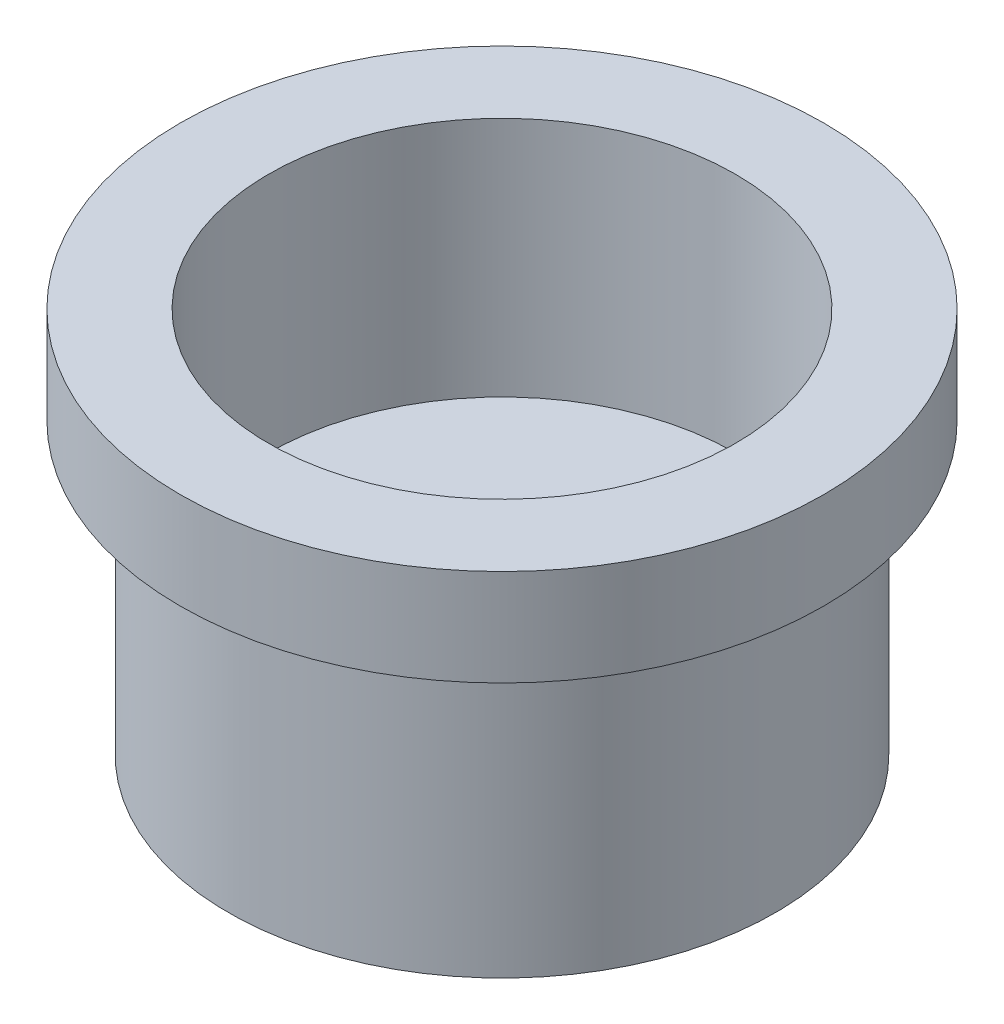
ISO-10303-21;
HEADER;
FILE_DESCRIPTION(('STEP AP214'),'2;1');
FILE_NAME('part.step','',(''),(''),'','','');
FILE_SCHEMA(('AUTOMOTIVE_DESIGN { 1 0 10303 214 1 1 1 1 }'));
ENDSEC;
DATA;
#1=APPLICATION_CONTEXT('core data for automotive mechanical design processes');
#2=APPLICATION_PROTOCOL_DEFINITION('international standard','automotive_design',2000,#1);
#3=PRODUCT_CONTEXT('',#1,'mechanical');
#4=PRODUCT('Part','Part','',(#3));
#5=PRODUCT_RELATED_PRODUCT_CATEGORY('part','',(#4));
#6=PRODUCT_DEFINITION_FORMATION('','',#4);
#7=PRODUCT_DEFINITION_CONTEXT('part definition',#1,'design');
#8=PRODUCT_DEFINITION('design','',#6,#7);
#9=PRODUCT_DEFINITION_SHAPE('','',#8);
#10=(LENGTH_UNIT() NAMED_UNIT(*) SI_UNIT(.MILLI.,.METRE.));
#11=(NAMED_UNIT(*) PLANE_ANGLE_UNIT() SI_UNIT($,.RADIAN.));
#12=(NAMED_UNIT(*) SI_UNIT($,.STERADIAN.) SOLID_ANGLE_UNIT());
#13=UNCERTAINTY_MEASURE_WITH_UNIT(LENGTH_MEASURE(1.E-05),#10,'distance_accuracy_value','');
#14=(GEOMETRIC_REPRESENTATION_CONTEXT(3) GLOBAL_UNCERTAINTY_ASSIGNED_CONTEXT((#13)) GLOBAL_UNIT_ASSIGNED_CONTEXT((#10,
#11,#12)) REPRESENTATION_CONTEXT('',''));
#15=CARTESIAN_POINT('',(0.,0.,0.));
#16=DIRECTION('',(0.,0.,1.));
#17=DIRECTION('',(1.,0.,0.));
#18=AXIS2_PLACEMENT_3D('',#15,#16,#17);
#19=CARTESIAN_POINT('',(-4.5,0.,0.));
#20=DIRECTION('',(0.,1.,0.));
#21=DIRECTION('',(0.,0.,1.));
#22=AXIS2_PLACEMENT_3D('',#19,#20,#21);
#23=PLANE('',#22);
#24=CARTESIAN_POINT('',(0.,0.,0.));
#25=DIRECTION('',(0.,-1.,0.));
#26=DIRECTION('',(0.,0.,-1.));
#27=AXIS2_PLACEMENT_3D('',#24,#25,#26);
#28=CIRCLE('',#27,2.5);
#29=CARTESIAN_POINT('',(0.,0.,-2.5));
#30=VERTEX_POINT('',#29);
#31=EDGE_CURVE('E10',#30,#30,#28,.T.);
#32=ORIENTED_EDGE('',*,*,#31,.F.);
#33=EDGE_LOOP('',(#32));
#34=FACE_BOUND('',#33,.T.);
#35=CARTESIAN_POINT('',(0.,0.,0.));
#36=DIRECTION('',(0.,-1.,0.));
#37=DIRECTION('',(0.,0.,-1.));
#38=AXIS2_PLACEMENT_3D('',#35,#36,#37);
#39=CIRCLE('',#38,4.5);
#40=CARTESIAN_POINT('',(0.,0.,-4.5));
#41=VERTEX_POINT('',#40);
#42=EDGE_CURVE('E96',#41,#41,#39,.T.);
#43=ORIENTED_EDGE('',*,*,#42,.T.);
#44=EDGE_LOOP('',(#43));
#45=FACE_BOUND('',#44,.T.);
#46=ADVANCED_FACE('F37',(#34,#45),#23,.F.);
#47=CARTESIAN_POINT('',(0.,0.,0.));
#48=DIRECTION('',(0.,-1.,0.));
#49=DIRECTION('',(0.,0.,-1.));
#50=AXIS2_PLACEMENT_3D('',#47,#48,#49);
#51=CYLINDRICAL_SURFACE('',#50,2.5);
#52=CARTESIAN_POINT('',(0.,11.,0.));
#53=DIRECTION('',(0.,-1.,0.));
#54=DIRECTION('',(0.,0.,-1.));
#55=AXIS2_PLACEMENT_3D('',#52,#53,#54);
#56=CIRCLE('',#55,2.5);
#57=CARTESIAN_POINT('',(0.,11.,-2.5));
#58=VERTEX_POINT('',#57);
#59=EDGE_CURVE('E44',#58,#58,#56,.T.);
#60=ORIENTED_EDGE('',*,*,#59,.F.);
#61=EDGE_LOOP('',(#60));
#62=FACE_BOUND('',#61,.T.);
#63=ORIENTED_EDGE('',*,*,#31,.T.);
#64=EDGE_LOOP('',(#63));
#65=FACE_BOUND('',#64,.T.);
#66=ADVANCED_FACE('F170',(#62,#65),#51,.F.);
#67=CARTESIAN_POINT('',(-2.5,11.,0.));
#68=DIRECTION('',(0.,-1.,0.));
#69=DIRECTION('',(0.,0.,-1.));
#70=AXIS2_PLACEMENT_3D('',#67,#68,#69);
#71=PLANE('',#70);
#72=CARTESIAN_POINT('',(0.,11.,0.));
#73=DIRECTION('',(0.,-1.,0.));
#74=DIRECTION('',(0.,0.,-1.));
#75=AXIS2_PLACEMENT_3D('',#72,#73,#74);
#76=CIRCLE('',#75,4.75);
#77=CARTESIAN_POINT('',(0.,11.,-4.75));
#78=VERTEX_POINT('',#77);
#79=EDGE_CURVE('E49',#78,#78,#76,.T.);
#80=ORIENTED_EDGE('',*,*,#79,.F.);
#81=EDGE_LOOP('',(#80));
#82=FACE_BOUND('',#81,.T.);
#83=ORIENTED_EDGE('',*,*,#59,.T.);
#84=EDGE_LOOP('',(#83));
#85=FACE_BOUND('',#84,.T.);
#86=ADVANCED_FACE('F165',(#82,#85),#71,.F.);
#87=CARTESIAN_POINT('',(0.,0.,0.));
#88=DIRECTION('',(0.,-1.,0.));
#89=DIRECTION('',(0.,0.,-1.));
#90=AXIS2_PLACEMENT_3D('',#87,#88,#89);
#91=CYLINDRICAL_SURFACE('',#90,4.75);
#92=CARTESIAN_POINT('',(0.,15.,0.));
#93=DIRECTION('',(0.,-1.,0.));
#94=DIRECTION('',(0.,0.,-1.));
#95=AXIS2_PLACEMENT_3D('',#92,#93,#94);
#96=CIRCLE('',#95,4.75);
#97=CARTESIAN_POINT('',(0.,15.,-4.75));
#98=VERTEX_POINT('',#97);
#99=EDGE_CURVE('E54',#98,#98,#96,.T.);
#100=ORIENTED_EDGE('',*,*,#99,.F.);
#101=EDGE_LOOP('',(#100));
#102=FACE_BOUND('',#101,.T.);
#103=ORIENTED_EDGE('',*,*,#79,.T.);
#104=EDGE_LOOP('',(#103));
#105=FACE_BOUND('',#104,.T.);
#106=ADVANCED_FACE('F159',(#102,#105),#91,.F.);
#107=CARTESIAN_POINT('',(-4.75,15.,0.));
#108=DIRECTION('',(0.,-1.,0.));
#109=DIRECTION('',(0.,0.,-1.));
#110=AXIS2_PLACEMENT_3D('',#107,#108,#109);
#111=PLANE('',#110);
#112=CARTESIAN_POINT('',(0.,15.,0.));
#113=DIRECTION('',(0.,-1.,0.));
#114=DIRECTION('',(0.,0.,-1.));
#115=AXIS2_PLACEMENT_3D('',#112,#113,#114);
#116=CIRCLE('',#115,14.5);
#117=CARTESIAN_POINT('',(0.,15.,-14.5));
#118=VERTEX_POINT('',#117);
#119=EDGE_CURVE('E60',#118,#118,#116,.T.);
#120=ORIENTED_EDGE('',*,*,#119,.F.);
#121=EDGE_LOOP('',(#120));
#122=FACE_BOUND('',#121,.T.);
#123=ORIENTED_EDGE('',*,*,#99,.T.);
#124=EDGE_LOOP('',(#123));
#125=FACE_BOUND('',#124,.T.);
#126=ADVANCED_FACE('F153',(#122,#125),#111,.F.);
#127=CARTESIAN_POINT('',(0.,0.,0.));
#128=DIRECTION('',(0.,-1.,0.));
#129=DIRECTION('',(0.,0.,-1.));
#130=AXIS2_PLACEMENT_3D('',#127,#128,#129);
#131=CYLINDRICAL_SURFACE('',#130,14.5);
#132=CARTESIAN_POINT('',(0.,30.,0.));
#133=DIRECTION('',(0.,-1.,0.));
#134=DIRECTION('',(0.,0.,-1.));
#135=AXIS2_PLACEMENT_3D('',#132,#133,#134);
#136=CIRCLE('',#135,14.5);
#137=CARTESIAN_POINT('',(0.,30.,-14.5));
#138=VERTEX_POINT('',#137);
#139=EDGE_CURVE('E64',#138,#138,#136,.T.);
#140=ORIENTED_EDGE('',*,*,#139,.F.);
#141=EDGE_LOOP('',(#140));
#142=FACE_BOUND('',#141,.T.);
#143=ORIENTED_EDGE('',*,*,#119,.T.);
#144=EDGE_LOOP('',(#143));
#145=FACE_BOUND('',#144,.T.);
#146=ADVANCED_FACE('F147',(#142,#145),#131,.F.);
#147=CARTESIAN_POINT('',(-14.5,30.,0.));
#148=DIRECTION('',(0.,-1.,0.));
#149=DIRECTION('',(0.,0.,-1.));
#150=AXIS2_PLACEMENT_3D('',#147,#148,#149);
#151=PLANE('',#150);
#152=CARTESIAN_POINT('',(0.,30.,0.));
#153=DIRECTION('',(0.,-1.,0.));
#154=DIRECTION('',(0.,0.,-1.));
#155=AXIS2_PLACEMENT_3D('',#152,#153,#154);
#156=CIRCLE('',#155,20.);
#157=CARTESIAN_POINT('',(0.,30.,-20.));
#158=VERTEX_POINT('',#157);
#159=EDGE_CURVE('E68',#158,#158,#156,.T.);
#160=ORIENTED_EDGE('',*,*,#159,.F.);
#161=EDGE_LOOP('',(#160));
#162=FACE_BOUND('',#161,.T.);
#163=ORIENTED_EDGE('',*,*,#139,.T.);
#164=EDGE_LOOP('',(#163));
#165=FACE_BOUND('',#164,.T.);
#166=ADVANCED_FACE('F141',(#162,#165),#151,.F.);
#167=CARTESIAN_POINT('',(0.,0.,0.));
#168=DIRECTION('',(0.,-1.,0.));
#169=DIRECTION('',(0.,0.,-1.));
#170=AXIS2_PLACEMENT_3D('',#167,#168,#169);
#171=CYLINDRICAL_SURFACE('',#170,20.);
#172=CARTESIAN_POINT('',(0.,24.,0.));
#173=DIRECTION('',(0.,-1.,0.));
#174=DIRECTION('',(0.,0.,-1.));
#175=AXIS2_PLACEMENT_3D('',#172,#173,#174);
#176=CIRCLE('',#175,20.);
#177=CARTESIAN_POINT('',(0.,24.,-20.));
#178=VERTEX_POINT('',#177);
#179=EDGE_CURVE('E72',#178,#178,#176,.T.);
#180=ORIENTED_EDGE('',*,*,#179,.F.);
#181=EDGE_LOOP('',(#180));
#182=FACE_BOUND('',#181,.T.);
#183=ORIENTED_EDGE('',*,*,#159,.T.);
#184=EDGE_LOOP('',(#183));
#185=FACE_BOUND('',#184,.T.);
#186=ADVANCED_FACE('F135',(#182,#185),#171,.T.);
#187=CARTESIAN_POINT('',(-20.,24.,0.));
#188=DIRECTION('',(0.,1.,0.));
#189=DIRECTION('',(0.,0.,1.));
#190=AXIS2_PLACEMENT_3D('',#187,#188,#189);
#191=PLANE('',#190);
#192=CARTESIAN_POINT('',(0.,24.,0.));
#193=DIRECTION('',(0.,-1.,0.));
#194=DIRECTION('',(0.,0.,-1.));
#195=AXIS2_PLACEMENT_3D('',#192,#193,#194);
#196=CIRCLE('',#195,17.);
#197=CARTESIAN_POINT('',(0.,24.,-17.));
#198=VERTEX_POINT('',#197);
#199=EDGE_CURVE('E76',#198,#198,#196,.T.);
#200=ORIENTED_EDGE('',*,*,#199,.F.);
#201=EDGE_LOOP('',(#200));
#202=FACE_BOUND('',#201,.T.);
#203=ORIENTED_EDGE('',*,*,#179,.T.);
#204=EDGE_LOOP('',(#203));
#205=FACE_BOUND('',#204,.T.);
#206=ADVANCED_FACE('F129',(#202,#205),#191,.F.);
#207=CARTESIAN_POINT('',(0.,0.,0.));
#208=DIRECTION('',(0.,-1.,0.));
#209=DIRECTION('',(0.,0.,-1.));
#210=AXIS2_PLACEMENT_3D('',#207,#208,#209);
#211=CYLINDRICAL_SURFACE('',#210,17.);
#212=CARTESIAN_POINT('',(0.,6.,0.));
#213=DIRECTION('',(0.,-1.,0.));
#214=DIRECTION('',(0.,0.,-1.));
#215=AXIS2_PLACEMENT_3D('',#212,#213,#214);
#216=CIRCLE('',#215,17.);
#217=CARTESIAN_POINT('',(0.,6.,-17.));
#218=VERTEX_POINT('',#217);
#219=EDGE_CURVE('E80',#218,#218,#216,.T.);
#220=ORIENTED_EDGE('',*,*,#219,.F.);
#221=EDGE_LOOP('',(#220));
#222=FACE_BOUND('',#221,.T.);
#223=ORIENTED_EDGE('',*,*,#199,.T.);
#224=EDGE_LOOP('',(#223));
#225=FACE_BOUND('',#224,.T.);
#226=ADVANCED_FACE('F123',(#222,#225),#211,.T.);
#227=CARTESIAN_POINT('',(-17.,6.,0.));
#228=DIRECTION('',(0.,1.,0.));
#229=DIRECTION('',(0.,0.,1.));
#230=AXIS2_PLACEMENT_3D('',#227,#228,#229);
#231=PLANE('',#230);
#232=CARTESIAN_POINT('',(0.,6.,0.));
#233=DIRECTION('',(0.,-1.,0.));
#234=DIRECTION('',(0.,0.,-1.));
#235=AXIS2_PLACEMENT_3D('',#232,#233,#234);
#236=CIRCLE('',#235,6.5);
#237=CARTESIAN_POINT('',(0.,6.,-6.5));
#238=VERTEX_POINT('',#237);
#239=EDGE_CURVE('E84',#238,#238,#236,.T.);
#240=ORIENTED_EDGE('',*,*,#239,.F.);
#241=EDGE_LOOP('',(#240));
#242=FACE_BOUND('',#241,.T.);
#243=ORIENTED_EDGE('',*,*,#219,.T.);
#244=EDGE_LOOP('',(#243));
#245=FACE_BOUND('',#244,.T.);
#246=ADVANCED_FACE('F117',(#242,#245),#231,.F.);
#247=CARTESIAN_POINT('',(0.,0.,0.));
#248=DIRECTION('',(0.,-1.,0.));
#249=DIRECTION('',(0.,0.,-1.));
#250=AXIS2_PLACEMENT_3D('',#247,#248,#249);
#251=CYLINDRICAL_SURFACE('',#250,6.5);
#252=CARTESIAN_POINT('',(0.,5.,0.));
#253=DIRECTION('',(0.,-1.,0.));
#254=DIRECTION('',(0.,0.,-1.));
#255=AXIS2_PLACEMENT_3D('',#252,#253,#254);
#256=CIRCLE('',#255,6.5);
#257=CARTESIAN_POINT('',(0.,5.,-6.5));
#258=VERTEX_POINT('',#257);
#259=EDGE_CURVE('E88',#258,#258,#256,.T.);
#260=ORIENTED_EDGE('',*,*,#259,.F.);
#261=EDGE_LOOP('',(#260));
#262=FACE_BOUND('',#261,.T.);
#263=ORIENTED_EDGE('',*,*,#239,.T.);
#264=EDGE_LOOP('',(#263));
#265=FACE_BOUND('',#264,.T.);
#266=ADVANCED_FACE('F111',(#262,#265),#251,.T.);
#267=CARTESIAN_POINT('',(-6.5,5.,0.));
#268=DIRECTION('',(0.,1.,0.));
#269=DIRECTION('',(0.,0.,1.));
#270=AXIS2_PLACEMENT_3D('',#267,#268,#269);
#271=PLANE('',#270);
#272=CARTESIAN_POINT('',(0.,5.,0.));
#273=DIRECTION('',(0.,-1.,0.));
#274=DIRECTION('',(0.,0.,-1.));
#275=AXIS2_PLACEMENT_3D('',#272,#273,#274);
#276=CIRCLE('',#275,4.5);
#277=CARTESIAN_POINT('',(0.,5.,-4.5));
#278=VERTEX_POINT('',#277);
#279=EDGE_CURVE('E92',#278,#278,#276,.T.);
#280=ORIENTED_EDGE('',*,*,#279,.F.);
#281=EDGE_LOOP('',(#280));
#282=FACE_BOUND('',#281,.T.);
#283=ORIENTED_EDGE('',*,*,#259,.T.);
#284=EDGE_LOOP('',(#283));
#285=FACE_BOUND('',#284,.T.);
#286=ADVANCED_FACE('F105',(#282,#285),#271,.F.);
#287=CARTESIAN_POINT('',(0.,0.,0.));
#288=DIRECTION('',(0.,-1.,0.));
#289=DIRECTION('',(0.,0.,-1.));
#290=AXIS2_PLACEMENT_3D('',#287,#288,#289);
#291=CYLINDRICAL_SURFACE('',#290,4.5);
#292=ORIENTED_EDGE('',*,*,#42,.F.);
#293=EDGE_LOOP('',(#292));
#294=FACE_BOUND('',#293,.T.);
#295=ORIENTED_EDGE('',*,*,#279,.T.);
#296=EDGE_LOOP('',(#295));
#297=FACE_BOUND('',#296,.T.);
#298=ADVANCED_FACE('F102',(#294,#297),#291,.T.);
#299=CLOSED_SHELL('',(#46,#66,#86,#106,#126,#146,#166,#186,#206,#226,#246,#266,#286,#298));
#300=MANIFOLD_SOLID_BREP('B2',#299);
#301=ADVANCED_BREP_SHAPE_REPRESENTATION('',(#18,#300),#14);
#302=SHAPE_DEFINITION_REPRESENTATION(#9,#301);
ENDSEC;
END-ISO-10303-21;
